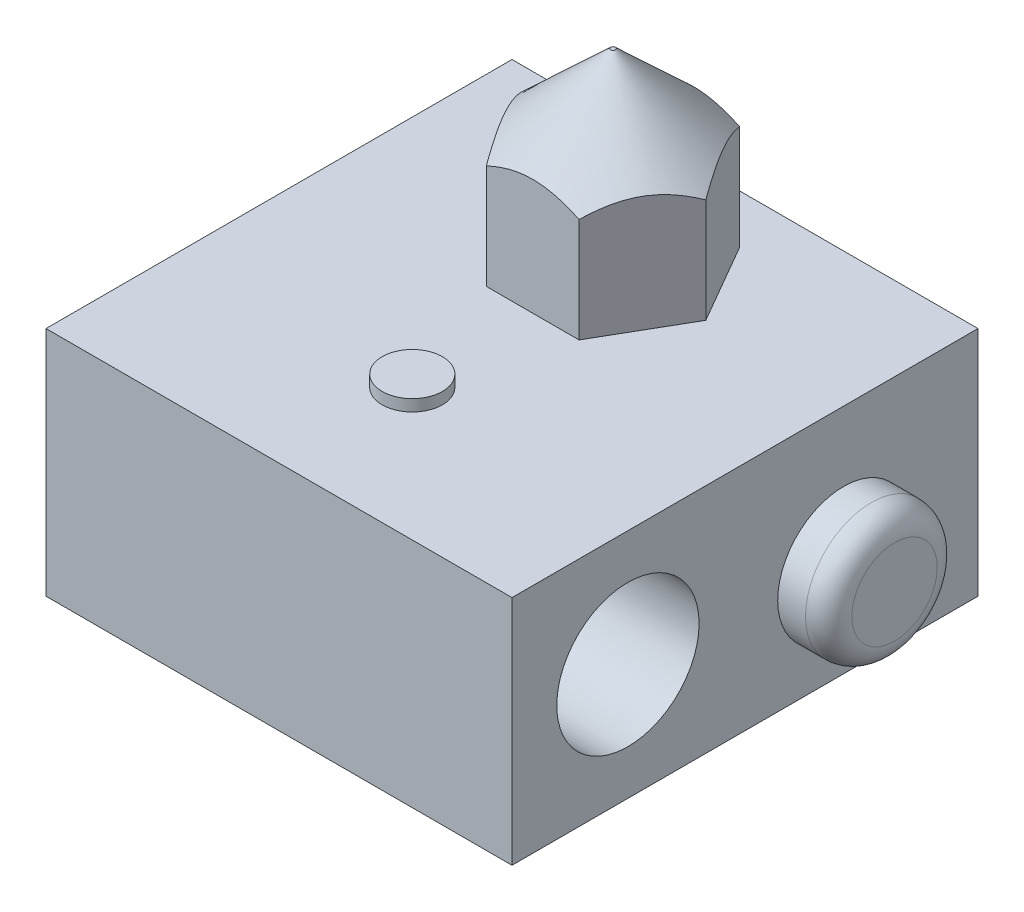
ISO-10303-21;
HEADER;
FILE_DESCRIPTION(('STEP AP214'),'2;1');
FILE_NAME('part.step','',(''),(''),'','','');
FILE_SCHEMA(('AUTOMOTIVE_DESIGN { 1 0 10303 214 1 1 1 1 }'));
ENDSEC;
DATA;
#1=APPLICATION_CONTEXT('core data for automotive mechanical design processes');
#2=APPLICATION_PROTOCOL_DEFINITION('international standard','automotive_design',2000,#1);
#3=PRODUCT_CONTEXT('',#1,'mechanical');
#4=PRODUCT('Part','Part','',(#3));
#5=PRODUCT_RELATED_PRODUCT_CATEGORY('part','',(#4));
#6=PRODUCT_DEFINITION_FORMATION('','',#4);
#7=PRODUCT_DEFINITION_CONTEXT('part definition',#1,'design');
#8=PRODUCT_DEFINITION('design','',#6,#7);
#9=PRODUCT_DEFINITION_SHAPE('','',#8);
#10=(LENGTH_UNIT() NAMED_UNIT(*) SI_UNIT(.MILLI.,.METRE.));
#11=(NAMED_UNIT(*) PLANE_ANGLE_UNIT() SI_UNIT($,.RADIAN.));
#12=(NAMED_UNIT(*) SI_UNIT($,.STERADIAN.) SOLID_ANGLE_UNIT());
#13=UNCERTAINTY_MEASURE_WITH_UNIT(LENGTH_MEASURE(1.E-05),#10,'distance_accuracy_value','');
#14=(GEOMETRIC_REPRESENTATION_CONTEXT(3) GLOBAL_UNCERTAINTY_ASSIGNED_CONTEXT((#13)) GLOBAL_UNIT_ASSIGNED_CONTEXT((#10,
#11,#12)) REPRESENTATION_CONTEXT('',''));
#15=CARTESIAN_POINT('',(0.,0.,0.));
#16=DIRECTION('',(0.,0.,1.));
#17=DIRECTION('',(1.,0.,0.));
#18=AXIS2_PLACEMENT_3D('',#15,#16,#17);
#19=CARTESIAN_POINT('',(0.,10.,0.));
#20=DIRECTION('',(0.,1.,0.));
#21=DIRECTION('',(0.,0.,1.));
#22=AXIS2_PLACEMENT_3D('',#19,#20,#21);
#23=PLANE('',#22);
#24=CARTESIAN_POINT('',(-10.,10.,-5.7));
#25=DIRECTION('',(0.,1.,0.));
#26=DIRECTION('',(0.,0.,1.));
#27=AXIS2_PLACEMENT_3D('',#24,#25,#26);
#28=CIRCLE('',#27,1.3);
#29=CARTESIAN_POINT('',(-10.,10.,-4.4));
#30=VERTEX_POINT('',#29);
#31=EDGE_CURVE('E457',#30,#30,#28,.T.);
#32=ORIENTED_EDGE('',*,*,#31,.F.);
#33=EDGE_LOOP('',(#32));
#34=FACE_BOUND('',#33,.T.);
#35=DIRECTION('',(0.,0.,-1.));
#36=VECTOR('',#35,1.);
#37=CARTESIAN_POINT('',(0.,10.,0.));
#38=LINE('',#37,#36);
#39=CARTESIAN_POINT('',(0.,10.,0.));
#40=VERTEX_POINT('',#39);
#41=CARTESIAN_POINT('',(0.,10.,-20.1));
#42=VERTEX_POINT('',#41);
#43=EDGE_CURVE('E159',#40,#42,#38,.T.);
#44=ORIENTED_EDGE('',*,*,#43,.T.);
#45=DIRECTION('',(-1.,0.,0.));
#46=VECTOR('',#45,1.);
#47=CARTESIAN_POINT('',(0.,10.,-20.1));
#48=LINE('',#47,#46);
#49=CARTESIAN_POINT('',(-20.1,10.,-20.1));
#50=VERTEX_POINT('',#49);
#51=EDGE_CURVE('E163',#42,#50,#48,.T.);
#52=ORIENTED_EDGE('',*,*,#51,.T.);
#53=DIRECTION('',(0.,0.,1.));
#54=VECTOR('',#53,1.);
#55=CARTESIAN_POINT('',(-20.1,10.,0.));
#56=LINE('',#55,#54);
#57=CARTESIAN_POINT('',(-20.1,10.,0.));
#58=VERTEX_POINT('',#57);
#59=EDGE_CURVE('E167',#50,#58,#56,.T.);
#60=ORIENTED_EDGE('',*,*,#59,.T.);
#61=DIRECTION('',(1.,0.,0.));
#62=VECTOR('',#61,1.);
#63=CARTESIAN_POINT('',(0.,10.,0.));
#64=LINE('',#63,#62);
#65=EDGE_CURVE('E170',#58,#40,#64,.T.);
#66=ORIENTED_EDGE('',*,*,#65,.T.);
#67=EDGE_LOOP('',(#44,#52,#60,#66));
#68=FACE_BOUND('',#67,.T.);
#69=DIRECTION('',(-1.,0.,0.));
#70=VECTOR('',#69,1.);
#71=CARTESIAN_POINT('',(-8.17776050806221,10.,-18.));
#72=LINE('',#71,#70);
#73=CARTESIAN_POINT('',(-8.17776050806221,10.,-18.));
#74=VERTEX_POINT('',#73);
#75=CARTESIAN_POINT('',(-12.1787978735463,10.,-18.));
#76=VERTEX_POINT('',#75);
#77=EDGE_CURVE('E268',#74,#76,#72,.T.);
#78=ORIENTED_EDGE('',*,*,#77,.F.);
#79=DIRECTION('',(-0.5,0.,-0.866025403784439));
#80=VECTOR('',#79,1.);
#81=CARTESIAN_POINT('',(-6.17724182532016,10.,-14.535));
#82=LINE('',#81,#80);
#83=CARTESIAN_POINT('',(-6.17724182532016,10.,-14.535));
#84=VERTEX_POINT('',#83);
#85=EDGE_CURVE('E131',#84,#74,#82,.T.);
#86=ORIENTED_EDGE('',*,*,#85,.F.);
#87=DIRECTION('',(0.5,0.,-0.866025403784439));
#88=VECTOR('',#87,1.);
#89=CARTESIAN_POINT('',(-8.17776050806222,10.,-11.07));
#90=LINE('',#89,#88);
#91=CARTESIAN_POINT('',(-8.17776050806222,10.,-11.07));
#92=VERTEX_POINT('',#91);
#93=EDGE_CURVE('E136',#92,#84,#90,.T.);
#94=ORIENTED_EDGE('',*,*,#93,.F.);
#95=DIRECTION('',(1.,0.,0.));
#96=VECTOR('',#95,1.);
#97=CARTESIAN_POINT('',(-12.1787978735463,10.,-11.07));
#98=LINE('',#97,#96);
#99=CARTESIAN_POINT('',(-12.1787978735463,10.,-11.07));
#100=VERTEX_POINT('',#99);
#101=EDGE_CURVE('E144',#100,#92,#98,.T.);
#102=ORIENTED_EDGE('',*,*,#101,.F.);
#103=DIRECTION('',(0.5,0.,0.866025403784439));
#104=VECTOR('',#103,1.);
#105=CARTESIAN_POINT('',(-14.1793165562884,10.,-14.535));
#106=LINE('',#105,#104);
#107=CARTESIAN_POINT('',(-14.1793165562884,10.,-14.535));
#108=VERTEX_POINT('',#107);
#109=EDGE_CURVE('E278',#108,#100,#106,.T.);
#110=ORIENTED_EDGE('',*,*,#109,.F.);
#111=DIRECTION('',(-0.5,0.,0.866025403784438));
#112=VECTOR('',#111,1.);
#113=CARTESIAN_POINT('',(-12.1787978735463,10.,-18.));
#114=LINE('',#113,#112);
#115=EDGE_CURVE('E271',#76,#108,#114,.T.);
#116=ORIENTED_EDGE('',*,*,#115,.F.);
#117=EDGE_LOOP('',(#78,#86,#94,#102,#110,#116));
#118=FACE_BOUND('',#117,.T.);
#119=ADVANCED_FACE('F39',(#34,#68,#118),#23,.T.);
#120=CARTESIAN_POINT('',(0.,10.,0.));
#121=DIRECTION('',(-1.,0.,0.));
#122=DIRECTION('',(0.,0.,1.));
#123=AXIS2_PLACEMENT_3D('',#120,#121,#122);
#124=PLANE('',#123);
#125=CARTESIAN_POINT('',(0.,4.16,-14.3));
#126=DIRECTION('',(-1.,0.,0.));
#127=DIRECTION('',(0.,0.,1.));
#128=AXIS2_PLACEMENT_3D('',#125,#126,#127);
#129=CIRCLE('',#128,2.84);
#130=CARTESIAN_POINT('',(0.,4.16,-11.46));
#131=VERTEX_POINT('',#130);
#132=EDGE_CURVE('E469',#131,#131,#129,.T.);
#133=ORIENTED_EDGE('',*,*,#132,.T.);
#134=EDGE_LOOP('',(#133));
#135=FACE_BOUND('',#134,.T.);
#136=CARTESIAN_POINT('',(0.,5.,-5.));
#137=DIRECTION('',(1.,0.,0.));
#138=DIRECTION('',(0.,0.,-1.));
#139=AXIS2_PLACEMENT_3D('',#136,#137,#138);
#140=CIRCLE('',#139,3.07);
#141=CARTESIAN_POINT('',(0.,5.,-8.07));
#142=VERTEX_POINT('',#141);
#143=EDGE_CURVE('E474',#142,#142,#140,.T.);
#144=ORIENTED_EDGE('',*,*,#143,.F.);
#145=EDGE_LOOP('',(#144));
#146=FACE_BOUND('',#145,.T.);
#147=DIRECTION('',(0.,0.,-1.));
#148=VECTOR('',#147,1.);
#149=CARTESIAN_POINT('',(0.,0.,0.));
#150=LINE('',#149,#148);
#151=CARTESIAN_POINT('',(0.,0.,0.));
#152=VERTEX_POINT('',#151);
#153=CARTESIAN_POINT('',(0.,0.,-20.1));
#154=VERTEX_POINT('',#153);
#155=EDGE_CURVE('E158',#152,#154,#150,.T.);
#156=ORIENTED_EDGE('',*,*,#155,.T.);
#157=DIRECTION('',(0.,-1.,0.));
#158=VECTOR('',#157,1.);
#159=CARTESIAN_POINT('',(0.,10.,-20.1));
#160=LINE('',#159,#158);
#161=EDGE_CURVE('E196',#42,#154,#160,.T.);
#162=ORIENTED_EDGE('',*,*,#161,.F.);
#163=ORIENTED_EDGE('',*,*,#43,.F.);
#164=DIRECTION('',(0.,-1.,0.));
#165=VECTOR('',#164,1.);
#166=CARTESIAN_POINT('',(0.,10.,0.));
#167=LINE('',#166,#165);
#168=EDGE_CURVE('E173',#40,#152,#167,.T.);
#169=ORIENTED_EDGE('',*,*,#168,.T.);
#170=EDGE_LOOP('',(#156,#162,#163,#169));
#171=FACE_BOUND('',#170,.T.);
#172=ADVANCED_FACE('F221',(#135,#146,#171),#124,.F.);
#173=CARTESIAN_POINT('',(0.,10.,-20.1));
#174=DIRECTION('',(0.,0.,1.));
#175=DIRECTION('',(1.,0.,0.));
#176=AXIS2_PLACEMENT_3D('',#173,#174,#175);
#177=PLANE('',#176);
#178=DIRECTION('',(-1.,0.,0.));
#179=VECTOR('',#178,1.);
#180=CARTESIAN_POINT('',(0.,0.,-20.1));
#181=LINE('',#180,#179);
#182=CARTESIAN_POINT('',(-20.1,0.,-20.1));
#183=VERTEX_POINT('',#182);
#184=EDGE_CURVE('E177',#154,#183,#181,.T.);
#185=ORIENTED_EDGE('',*,*,#184,.T.);
#186=DIRECTION('',(0.,-1.,0.));
#187=VECTOR('',#186,1.);
#188=CARTESIAN_POINT('',(-20.1,10.,-20.1));
#189=LINE('',#188,#187);
#190=EDGE_CURVE('E192',#50,#183,#189,.T.);
#191=ORIENTED_EDGE('',*,*,#190,.F.);
#192=ORIENTED_EDGE('',*,*,#51,.F.);
#193=ORIENTED_EDGE('',*,*,#161,.T.);
#194=EDGE_LOOP('',(#185,#191,#192,#193));
#195=FACE_BOUND('',#194,.T.);
#196=ADVANCED_FACE('F227',(#195),#177,.F.);
#197=CARTESIAN_POINT('',(-20.1,10.,0.));
#198=DIRECTION('',(1.,0.,0.));
#199=DIRECTION('',(0.,0.,-1.));
#200=AXIS2_PLACEMENT_3D('',#197,#198,#199);
#201=PLANE('',#200);
#202=CARTESIAN_POINT('',(-20.1,5.,-5.));
#203=DIRECTION('',(1.,0.,0.));
#204=DIRECTION('',(0.,0.,-1.));
#205=AXIS2_PLACEMENT_3D('',#202,#203,#204);
#206=CIRCLE('',#205,3.07);
#207=CARTESIAN_POINT('',(-20.1,5.,-8.07));
#208=VERTEX_POINT('',#207);
#209=EDGE_CURVE('E475',#208,#208,#206,.T.);
#210=ORIENTED_EDGE('',*,*,#209,.T.);
#211=EDGE_LOOP('',(#210));
#212=FACE_BOUND('',#211,.T.);
#213=DIRECTION('',(0.,0.,1.));
#214=VECTOR('',#213,1.);
#215=CARTESIAN_POINT('',(-20.1,0.,0.));
#216=LINE('',#215,#214);
#217=CARTESIAN_POINT('',(-20.1,0.,0.));
#218=VERTEX_POINT('',#217);
#219=EDGE_CURVE('E180',#183,#218,#216,.T.);
#220=ORIENTED_EDGE('',*,*,#219,.T.);
#221=DIRECTION('',(0.,-1.,0.));
#222=VECTOR('',#221,1.);
#223=CARTESIAN_POINT('',(-20.1,10.,0.));
#224=LINE('',#223,#222);
#225=EDGE_CURVE('E188',#58,#218,#224,.T.);
#226=ORIENTED_EDGE('',*,*,#225,.F.);
#227=ORIENTED_EDGE('',*,*,#59,.F.);
#228=ORIENTED_EDGE('',*,*,#190,.T.);
#229=EDGE_LOOP('',(#220,#226,#227,#228));
#230=FACE_BOUND('',#229,.T.);
#231=ADVANCED_FACE('F242',(#212,#230),#201,.F.);
#232=CARTESIAN_POINT('',(0.,10.,0.));
#233=DIRECTION('',(0.,0.,-1.));
#234=DIRECTION('',(-1.,0.,0.));
#235=AXIS2_PLACEMENT_3D('',#232,#233,#234);
#236=PLANE('',#235);
#237=DIRECTION('',(1.,0.,0.));
#238=VECTOR('',#237,1.);
#239=CARTESIAN_POINT('',(0.,0.,0.));
#240=LINE('',#239,#238);
#241=EDGE_CURVE('E164',#218,#152,#240,.T.);
#242=ORIENTED_EDGE('',*,*,#241,.T.);
#243=ORIENTED_EDGE('',*,*,#168,.F.);
#244=ORIENTED_EDGE('',*,*,#65,.F.);
#245=ORIENTED_EDGE('',*,*,#225,.T.);
#246=EDGE_LOOP('',(#242,#243,#244,#245));
#247=FACE_BOUND('',#246,.T.);
#248=ADVANCED_FACE('F238',(#247),#236,.F.);
#249=CARTESIAN_POINT('',(0.,0.,0.));
#250=DIRECTION('',(0.,1.,0.));
#251=DIRECTION('',(0.,0.,1.));
#252=AXIS2_PLACEMENT_3D('',#249,#250,#251);
#253=PLANE('',#252);
#254=CARTESIAN_POINT('',(-10.1782791908043,0.,-14.535));
#255=DIRECTION('',(0.,-1.,0.));
#256=DIRECTION('',(0.,0.,-1.));
#257=AXIS2_PLACEMENT_3D('',#254,#255,#256);
#258=CIRCLE('',#257,2.675);
#259=CARTESIAN_POINT('',(-10.1782791908043,0.,-17.21));
#260=VERTEX_POINT('',#259);
#261=EDGE_CURVE('E456',#260,#260,#258,.T.);
#262=ORIENTED_EDGE('',*,*,#261,.F.);
#263=EDGE_LOOP('',(#262));
#264=FACE_BOUND('',#263,.T.);
#265=ORIENTED_EDGE('',*,*,#155,.F.);
#266=ORIENTED_EDGE('',*,*,#241,.F.);
#267=ORIENTED_EDGE('',*,*,#219,.F.);
#268=ORIENTED_EDGE('',*,*,#184,.F.);
#269=EDGE_LOOP('',(#265,#266,#267,#268));
#270=FACE_BOUND('',#269,.T.);
#271=ADVANCED_FACE('F235',(#264,#270),#253,.F.);
#272=CARTESIAN_POINT('',(-6.17724182532016,18.15,-14.535));
#273=DIRECTION('',(-0.866025403784439,0.,0.5));
#274=DIRECTION('',(0.5,0.,0.866025403784439));
#275=AXIS2_PLACEMENT_3D('',#272,#273,#274);
#276=PLANE('',#275);
#277=DIRECTION('',(0.,-1.,0.));
#278=VECTOR('',#277,1.);
#279=CARTESIAN_POINT('',(-8.17776050806221,18.15,-18.));
#280=LINE('',#279,#278);
#281=CARTESIAN_POINT('',(-8.17776050806221,14.5,-18.));
#282=VERTEX_POINT('',#281);
#283=EDGE_CURVE('E129',#282,#74,#280,.T.);
#284=ORIENTED_EDGE('',*,*,#283,.F.);
#285=CARTESIAN_POINT('',(-8.17787597811605,14.4998919559333,-18.0002));
#286=CARTESIAN_POINT('',(-8.10496643233774,14.5680581905201,-17.8739169623552));
#287=CARTESIAN_POINT('',(-8.03088205093946,14.631847473232,-17.7455990497261));
#288=CARTESIAN_POINT('',(-7.8799847268207,14.7475698967508,-17.4842372176262));
#289=CARTESIAN_POINT('',(-7.80315894483399,14.7994354177771,-17.351171059894));
#290=CARTESIAN_POINT('',(-7.64859243023081,14.8865960133476,-17.0834540034525));
#291=CARTESIAN_POINT('',(-7.57089214640926,14.9221688865829,-16.948873164111));
#292=CARTESIAN_POINT('',(-7.41406683961953,14.9746279401331,-16.6772437648386));
#293=CARTESIAN_POINT('',(-7.33494562051771,14.9915581130619,-16.5402017933975));
#294=CARTESIAN_POINT('',(-7.18636819507381,15.0040893238164,-16.2828581436708));
#295=CARTESIAN_POINT('',(-7.11696263852111,15.002129289844,-16.162644193394));
#296=CARTESIAN_POINT('',(-6.97865168973416,14.9828131826316,-15.9230826028519));
#297=CARTESIAN_POINT('',(-6.90974667970046,14.9654463827039,-15.8037356245775));
#298=CARTESIAN_POINT('',(-6.77315384892855,14.9167875549176,-15.5671499017309));
#299=CARTESIAN_POINT('',(-6.70546701988292,14.8854846721375,-15.4499128748206));
#300=CARTESIAN_POINT('',(-6.57176241443205,14.8111774445511,-15.2183297049738));
#301=CARTESIAN_POINT('',(-6.50574429716871,14.7681755109005,-15.1039829716537));
#302=CARTESIAN_POINT('',(-6.39579541981121,14.687648702307,-14.9135459298353));
#303=CARTESIAN_POINT('',(-6.3514003497324,14.6526014993247,-14.8366514128532));
#304=CARTESIAN_POINT('',(-6.26358861588134,14.57884745446,-14.6845570283225));
#305=CARTESIAN_POINT('',(-6.22016868514778,14.540156217657,-14.6093515022308));
#306=CARTESIAN_POINT('',(-6.17712635526633,14.4998919559333,-14.5348));
#307=B_SPLINE_CURVE_WITH_KNOTS('',3,(#285,#286,#287,#288,#289,#290,#291,#292,#293,#294,#295,
#296,#297,#298,#299,#300,#301,#302,#303,#304,#305,#306),.UNSPECIFIED.,.F.,.F.,(4,2,2,2,2,2,2,2,
2,2,4),(0.,0.483241120159835,0.969158586776282,1.44645055165871,1.92261378412961,
2.33821493595867,2.75410567000706,3.17032091282932,3.58645043924788,3.87273714789289,
4.15784925299525),.UNSPECIFIED.);
#308=CARTESIAN_POINT('',(-6.17724182532016,14.5,-14.535));
#309=VERTEX_POINT('',#308);
#310=EDGE_CURVE('E118',#282,#309,#307,.T.);
#311=ORIENTED_EDGE('',*,*,#310,.T.);
#312=DIRECTION('',(0.,-1.,0.));
#313=VECTOR('',#312,1.);
#314=CARTESIAN_POINT('',(-6.17724182532016,18.15,-14.535));
#315=LINE('',#314,#313);
#316=EDGE_CURVE('E128',#309,#84,#315,.T.);
#317=ORIENTED_EDGE('',*,*,#316,.T.);
#318=ORIENTED_EDGE('',*,*,#85,.T.);
#319=EDGE_LOOP('',(#284,#311,#317,#318));
#320=FACE_BOUND('',#319,.T.);
#321=ADVANCED_FACE('F126',(#320),#276,.F.);
#322=CARTESIAN_POINT('',(-8.17776050806221,18.15,-18.));
#323=DIRECTION('',(0.,0.,1.));
#324=DIRECTION('',(1.,0.,0.));
#325=AXIS2_PLACEMENT_3D('',#322,#323,#324);
#326=PLANE('',#325);
#327=DIRECTION('',(0.,-1.,0.));
#328=VECTOR('',#327,1.);
#329=CARTESIAN_POINT('',(-12.1787978735463,18.15,-18.));
#330=LINE('',#329,#328);
#331=CARTESIAN_POINT('',(-12.1787978735463,14.5,-18.));
#332=VERTEX_POINT('',#331);
#333=EDGE_CURVE('E153',#332,#76,#330,.T.);
#334=ORIENTED_EDGE('',*,*,#333,.F.);
#335=CARTESIAN_POINT('',(-19.0147006174352,9.36285671163671,-18.));
#336=CARTESIAN_POINT('',(-18.8758133775291,9.48383531474893,-18.));
#337=CARTESIAN_POINT('',(-18.7367404273081,9.60460059468767,-18.));
#338=CARTESIAN_POINT('',(-18.45816397849,9.84563548071962,-18.));
#339=CARTESIAN_POINT('',(-18.3186604768172,9.9659050832574,-18.));
#340=CARTESIAN_POINT('',(-17.8992454023463,10.3260128051485,-18.));
#341=CARTESIAN_POINT('',(-17.6186010882329,10.5649998675573,-18.));
#342=CARTESIAN_POINT('',(-17.0476452031293,11.0458456302739,-18.));
#343=CARTESIAN_POINT('',(-16.7572676651225,11.2876261081019,-18.));
#344=CARTESIAN_POINT('',(-16.1728970014436,11.766494109917,-18.));
#345=CARTESIAN_POINT('',(-15.8789058243607,12.0035839974825,-18.));
#346=CARTESIAN_POINT('',(-15.4338986169012,12.3540732958855,-18.));
#347=CARTESIAN_POINT('',(-15.2849037036489,12.4700372910427,-18.));
#348=CARTESIAN_POINT('',(-14.9852696503361,12.699818265257,-18.));
#349=CARTESIAN_POINT('',(-14.834630553004,12.8136352998998,-18.));
#350=CARTESIAN_POINT('',(-14.531077959979,13.0387593329264,-18.));
#351=CARTESIAN_POINT('',(-14.3781609749968,13.1500616393109,-18.));
#352=CARTESIAN_POINT('',(-14.0698428969585,13.3691656363101,-18.));
#353=CARTESIAN_POINT('',(-13.9144419509355,13.4769675329878,-18.));
#354=CARTESIAN_POINT('',(-13.6020787821066,13.6869531356201,-18.));
#355=CARTESIAN_POINT('',(-13.4451467443273,13.7891815159524,-18.));
#356=CARTESIAN_POINT('',(-13.127451986753,13.9876652341221,-18.));
#357=CARTESIAN_POINT('',(-12.9666881163968,14.0839187458396,-18.));
#358=CARTESIAN_POINT('',(-12.6409745794327,14.2679634766559,-18.));
#359=CARTESIAN_POINT('',(-12.4760387357564,14.3557789383225,-18.));
#360=CARTESIAN_POINT('',(-12.1406726647224,14.520103986693,-18.));
#361=CARTESIAN_POINT('',(-11.9702471144701,14.5966229028573,-18.));
#362=CARTESIAN_POINT('',(-11.6850195932294,14.709551783688,-18.));
#363=CARTESIAN_POINT('',(-11.5720374067441,14.7505378589375,-18.));
#364=CARTESIAN_POINT('',(-11.3434647431741,14.8246187512217,-18.));
#365=CARTESIAN_POINT('',(-11.2278739974118,14.8577127512867,-18.));
#366=CARTESIAN_POINT('',(-10.9950711988485,14.9143343667784,-18.));
#367=CARTESIAN_POINT('',(-10.8778729919812,14.9379180574556,-18.));
#368=CARTESIAN_POINT('',(-10.6418398539737,14.9744691769164,-18.));
#369=CARTESIAN_POINT('',(-10.5230054451897,14.9874399174736,-18.));
#370=CARTESIAN_POINT('',(-10.2835219440167,15.0019914014286,-18.));
#371=CARTESIAN_POINT('',(-10.1628662341173,15.0034656610684,-18.));
#372=CARTESIAN_POINT('',(-9.92199330892492,14.9946380401109,-18.));
#373=CARTESIAN_POINT('',(-9.80177610627438,14.9843358226397,-18.));
#374=CARTESIAN_POINT('',(-9.56224698832582,14.9525839466569,-18.));
#375=CARTESIAN_POINT('',(-9.44294241927608,14.9310797862718,-18.));
#376=CARTESIAN_POINT('',(-9.2065759930759,14.8781874113085,-18.));
#377=CARTESIAN_POINT('',(-9.08951448631399,14.8467976656436,-18.));
#378=CARTESIAN_POINT('',(-8.74809350716715,14.7419200376983,-18.));
#379=CARTESIAN_POINT('',(-8.52730892733131,14.6567468497045,-18.));
#380=CARTESIAN_POINT('',(-8.20342693096893,14.5130093637491,-18.));
#381=CARTESIAN_POINT('',(-8.09657424868274,14.4623726214482,-18.));
#382=CARTESIAN_POINT('',(-7.88504621948667,14.3567200017091,-18.));
#383=CARTESIAN_POINT('',(-7.78037064069987,14.3017045936735,-18.));
#384=CARTESIAN_POINT('',(-7.5717186086707,14.1874297277328,-18.));
#385=CARTESIAN_POINT('',(-7.46776627391139,14.1281266726738,-18.));
#386=CARTESIAN_POINT('',(-7.26161606646823,14.0065374423959,-18.));
#387=CARTESIAN_POINT('',(-7.15941832526858,13.9442510449279,-18.));
#388=CARTESIAN_POINT('',(-6.85531232569592,13.7538597331894,-18.));
#389=CARTESIAN_POINT('',(-6.65568907137518,13.6221092223889,-18.));
#390=CARTESIAN_POINT('',(-6.22534261625957,13.3274697393368,-18.));
#391=CARTESIAN_POINT('',(-5.99553241653929,13.1632618826498,-18.));
#392=CARTESIAN_POINT('',(-5.54055017578016,12.8285058919325,-18.));
#393=CARTESIAN_POINT('',(-5.31537889933428,12.6579567255089,-18.));
#394=CARTESIAN_POINT('',(-4.86828775836992,12.3122313212827,-18.));
#395=CARTESIAN_POINT('',(-4.64637120946111,12.1370508141565,-18.));
#396=CARTESIAN_POINT('',(-4.20515515373602,11.7834213555717,-18.));
#397=CARTESIAN_POINT('',(-3.98585571969953,11.604972313566,-18.));
#398=CARTESIAN_POINT('',(-3.5624865465556,11.2564908445819,-18.));
#399=CARTESIAN_POINT('',(-3.35829807952971,11.0866023547107,-18.));
#400=CARTESIAN_POINT('',(-2.95134030390075,10.7451266564853,-18.));
#401=CARTESIAN_POINT('',(-2.74857102744141,10.5735394098666,-18.));
#402=CARTESIAN_POINT('',(-2.34460671374112,10.2293826863745,-18.));
#403=CARTESIAN_POINT('',(-2.14340925814877,10.0568160446385,-18.));
#404=CARTESIAN_POINT('',(-1.74196914989016,9.71059405451314,-18.));
#405=CARTESIAN_POINT('',(-1.54172645339962,9.53693875695783,-18.));
#406=CARTESIAN_POINT('',(-1.34185776417337,9.36285671163671,-18.));
#407=B_SPLINE_CURVE_WITH_KNOTS('',3,(#335,#336,#337,#338,#339,#340,#341,#342,#343,#344,#345,
#346,#347,#348,#349,#350,#351,#352,#353,#354,#355,#356,#357,#358,#359,#360,#361,#362,#363,#364,
#365,#366,#367,#368,#369,#370,#371,#372,#373,#374,#375,#376,#377,#378,#379,#380,#381,#382,#383,
#384,#385,#386,#387,#388,#389,#390,#391,#392,#393,#394,#395,#396,#397,#398,#399,#400,#401,#402,
#403,#404,#405,#406),.UNSPECIFIED.,.F.,.F.,(4,2,2,2,2,2,2,2,2,2,2,2,2,2,2,2,2,2,2,2,2,2,2,2,2,2,
2,2,2,2,2,2,2,2,2,4),(0.,0.552565633241739,1.1051352230673,2.21095859860381,3.34450616794044,
4.47746719654478,5.04386597618599,5.61025007135914,6.17761576498881,6.74494799800572,
7.30672532600763,7.86867351505128,8.42895566610949,8.98877247773612,9.34910108955568,
9.7094669855944,10.067675860957,10.4257729144773,10.7871828730284,11.1486031702067,
11.5117985745181,11.8750502584882,12.5829485738153,12.9376397845179,13.2922930226173,
13.6512740372505,14.0102818364914,14.7276026267629,15.5747973988184,16.4221307071156,
17.2702744038191,18.1184416319854,18.9152964030544,19.712169164335,20.5073611275623,
21.302516232465),.UNSPECIFIED.);
#408=EDGE_CURVE('E132',#332,#282,#407,.T.);
#409=ORIENTED_EDGE('',*,*,#408,.T.);
#410=ORIENTED_EDGE('',*,*,#283,.T.);
#411=ORIENTED_EDGE('',*,*,#77,.T.);
#412=EDGE_LOOP('',(#334,#409,#410,#411));
#413=FACE_BOUND('',#412,.T.);
#414=ADVANCED_FACE('F298',(#413),#326,.F.);
#415=CARTESIAN_POINT('',(-12.1787978735463,18.15,-18.));
#416=DIRECTION('',(0.866025403784438,0.,0.5));
#417=DIRECTION('',(0.5,0.,-0.866025403784438));
#418=AXIS2_PLACEMENT_3D('',#415,#416,#417);
#419=PLANE('',#418);
#420=DIRECTION('',(0.,-1.,0.));
#421=VECTOR('',#420,1.);
#422=CARTESIAN_POINT('',(-14.1793165562884,18.15,-14.535));
#423=LINE('',#422,#421);
#424=CARTESIAN_POINT('',(-14.1793165562884,14.5,-14.535));
#425=VERTEX_POINT('',#424);
#426=EDGE_CURVE('E150',#425,#108,#423,.T.);
#427=ORIENTED_EDGE('',*,*,#426,.F.);
#428=CARTESIAN_POINT('',(-14.1794320263422,14.4998919559333,-14.5348));
#429=CARTESIAN_POINT('',(-14.1065224805639,14.5680581905201,-14.6610830376448));
#430=CARTESIAN_POINT('',(-14.0324380991656,14.631847473232,-14.7894009502739));
#431=CARTESIAN_POINT('',(-13.8815407750469,14.7475698967508,-15.0507627823738));
#432=CARTESIAN_POINT('',(-13.8047149930601,14.7994354177771,-15.183828940106));
#433=CARTESIAN_POINT('',(-13.650148478457,14.8865960133476,-15.4515459965475));
#434=CARTESIAN_POINT('',(-13.5724481946354,14.9221688865829,-15.586126835889));
#435=CARTESIAN_POINT('',(-13.4156228878457,14.9746279401331,-15.8577562351614));
#436=CARTESIAN_POINT('',(-13.3365016687439,14.9915581130619,-15.9947982066025));
#437=CARTESIAN_POINT('',(-13.1879242433,15.0040893238164,-16.2521418563292));
#438=CARTESIAN_POINT('',(-13.1185186867473,15.002129289844,-16.372355806606));
#439=CARTESIAN_POINT('',(-12.9802077379603,14.9828131826316,-16.6119173971481));
#440=CARTESIAN_POINT('',(-12.9113027279266,14.9654463827039,-16.7312643754225));
#441=CARTESIAN_POINT('',(-12.7747098971547,14.9167875549176,-16.9678500982691));
#442=CARTESIAN_POINT('',(-12.7070230681091,14.8854846721375,-17.0850871251794));
#443=CARTESIAN_POINT('',(-12.5733184626582,14.8111774445511,-17.3166702950262));
#444=CARTESIAN_POINT('',(-12.5073003453949,14.7681755109005,-17.4310170283463));
#445=CARTESIAN_POINT('',(-12.3973514680374,14.687648702307,-17.6214540701647));
#446=CARTESIAN_POINT('',(-12.3529563979586,14.6526014993247,-17.6983485871468));
#447=CARTESIAN_POINT('',(-12.2651446641075,14.57884745446,-17.8504429716775));
#448=CARTESIAN_POINT('',(-12.2217247333739,14.540156217657,-17.9256484977692));
#449=CARTESIAN_POINT('',(-12.1786824034925,14.4998919559333,-18.0002));
#450=B_SPLINE_CURVE_WITH_KNOTS('',3,(#428,#429,#430,#431,#432,#433,#434,#435,#436,#437,#438,
#439,#440,#441,#442,#443,#444,#445,#446,#447,#448,#449),.UNSPECIFIED.,.F.,.F.,(4,2,2,2,2,2,2,2,
2,2,4),(0.,0.483241120159832,0.96915858677628,1.44645055165871,1.92261378412961,
2.33821493595867,2.75410567000706,3.17032091282932,3.58645043924788,3.87273714789289,
4.15784925299525),.UNSPECIFIED.);
#451=EDGE_CURVE('E297',#425,#332,#450,.T.);
#452=ORIENTED_EDGE('',*,*,#451,.T.);
#453=ORIENTED_EDGE('',*,*,#333,.T.);
#454=ORIENTED_EDGE('',*,*,#115,.T.);
#455=EDGE_LOOP('',(#427,#452,#453,#454));
#456=FACE_BOUND('',#455,.T.);
#457=ADVANCED_FACE('F296',(#456),#419,.F.);
#458=CARTESIAN_POINT('',(-14.1793165562884,18.15,-14.535));
#459=DIRECTION('',(0.866025403784439,0.,-0.5));
#460=DIRECTION('',(-0.5,0.,-0.866025403784439));
#461=AXIS2_PLACEMENT_3D('',#458,#459,#460);
#462=PLANE('',#461);
#463=DIRECTION('',(0.,-1.,0.));
#464=VECTOR('',#463,1.);
#465=CARTESIAN_POINT('',(-12.1787978735463,18.15,-11.07));
#466=LINE('',#465,#464);
#467=CARTESIAN_POINT('',(-12.1787978735463,14.5,-11.07));
#468=VERTEX_POINT('',#467);
#469=EDGE_CURVE('E142',#468,#100,#466,.T.);
#470=ORIENTED_EDGE('',*,*,#469,.F.);
#471=CARTESIAN_POINT('',(-12.1786824034925,14.4998919559333,-11.0698));
#472=CARTESIAN_POINT('',(-12.2515919492708,14.5680581905201,-11.1960830376448));
#473=CARTESIAN_POINT('',(-12.3256763306691,14.631847473232,-11.3244009502739));
#474=CARTESIAN_POINT('',(-12.4765736547878,14.7475698967508,-11.5857627823738));
#475=CARTESIAN_POINT('',(-12.5533994367745,14.7994354177771,-11.718828940106));
#476=CARTESIAN_POINT('',(-12.7079659513777,14.8865960133476,-11.9865459965475));
#477=CARTESIAN_POINT('',(-12.7856662351993,14.9221688865829,-12.121126835889));
#478=CARTESIAN_POINT('',(-12.942491541989,14.9746279401331,-12.3927562351614));
#479=CARTESIAN_POINT('',(-13.0216127610908,14.9915581130619,-12.5297982066025));
#480=CARTESIAN_POINT('',(-13.1701901865347,15.0040893238164,-12.7871418563292));
#481=CARTESIAN_POINT('',(-13.2395957430874,15.002129289844,-12.907355806606));
#482=CARTESIAN_POINT('',(-13.3779066918744,14.9828131826316,-13.1469173971481));
#483=CARTESIAN_POINT('',(-13.4468117019081,14.9654463827039,-13.2662643754225));
#484=CARTESIAN_POINT('',(-13.58340453268,14.9167875549176,-13.5028500982691));
#485=CARTESIAN_POINT('',(-13.6510913617256,14.8854846721375,-13.6200871251794));
#486=CARTESIAN_POINT('',(-13.7847959671765,14.8111774445511,-13.8516702950262));
#487=CARTESIAN_POINT('',(-13.8508140844398,14.7681755109005,-13.9660170283463));
#488=CARTESIAN_POINT('',(-13.9607629617973,14.687648702307,-14.1564540701647));
#489=CARTESIAN_POINT('',(-14.0051580318761,14.6526014993247,-14.2333485871468));
#490=CARTESIAN_POINT('',(-14.0929697657272,14.57884745446,-14.3854429716775));
#491=CARTESIAN_POINT('',(-14.1363896964608,14.540156217657,-14.4606484977692));
#492=CARTESIAN_POINT('',(-14.1794320263422,14.4998919559333,-14.5352));
#493=B_SPLINE_CURVE_WITH_KNOTS('',3,(#471,#472,#473,#474,#475,#476,#477,#478,#479,#480,#481,
#482,#483,#484,#485,#486,#487,#488,#489,#490,#491,#492),.UNSPECIFIED.,.F.,.F.,(4,2,2,2,2,2,2,2,
2,2,4),(0.,0.483241120159834,0.969158586776284,1.44645055165871,1.92261378412962,
2.33821493595868,2.75410567000706,3.17032091282932,3.58645043924788,3.8727371478929,
4.15784925299526),.UNSPECIFIED.);
#494=EDGE_CURVE('E293',#468,#425,#493,.T.);
#495=ORIENTED_EDGE('',*,*,#494,.T.);
#496=ORIENTED_EDGE('',*,*,#426,.T.);
#497=ORIENTED_EDGE('',*,*,#109,.T.);
#498=EDGE_LOOP('',(#470,#495,#496,#497));
#499=FACE_BOUND('',#498,.T.);
#500=ADVANCED_FACE('F290',(#499),#462,.F.);
#501=CARTESIAN_POINT('',(-12.1787978735463,18.15,-11.07));
#502=DIRECTION('',(0.,0.,-1.));
#503=DIRECTION('',(-1.,0.,0.));
#504=AXIS2_PLACEMENT_3D('',#501,#502,#503);
#505=PLANE('',#504);
#506=DIRECTION('',(0.,-1.,0.));
#507=VECTOR('',#506,1.);
#508=CARTESIAN_POINT('',(-8.17776050806222,18.15,-11.07));
#509=LINE('',#508,#507);
#510=CARTESIAN_POINT('',(-8.17776050806222,14.5,-11.07));
#511=VERTEX_POINT('',#510);
#512=EDGE_CURVE('E62',#511,#92,#509,.T.);
#513=ORIENTED_EDGE('',*,*,#512,.F.);
#514=CARTESIAN_POINT('',(-1.34185776417338,9.36285671163672,-11.07));
#515=CARTESIAN_POINT('',(-1.48074500407941,9.48383531474893,-11.07));
#516=CARTESIAN_POINT('',(-1.61981795430042,9.60460059468768,-11.07));
#517=CARTESIAN_POINT('',(-1.89839440311849,9.84563548071963,-11.07));
#518=CARTESIAN_POINT('',(-2.03789790479131,9.96590508325741,-11.07));
#519=CARTESIAN_POINT('',(-2.45731297926223,10.3260128051485,-11.07));
#520=CARTESIAN_POINT('',(-2.73795729337567,10.5649998675573,-11.07));
#521=CARTESIAN_POINT('',(-3.30891317847928,11.0458456302739,-11.07));
#522=CARTESIAN_POINT('',(-3.59929071648602,11.2876261081019,-11.07));
#523=CARTESIAN_POINT('',(-4.18366138016491,11.766494109917,-11.07));
#524=CARTESIAN_POINT('',(-4.47765255724781,12.0035839974825,-11.07));
#525=CARTESIAN_POINT('',(-4.9226597647073,12.3540732958855,-11.07));
#526=CARTESIAN_POINT('',(-5.0716546779596,12.4700372910427,-11.07));
#527=CARTESIAN_POINT('',(-5.37128873127241,12.699818265257,-11.07));
#528=CARTESIAN_POINT('',(-5.52192782860451,12.8136352998998,-11.07));
#529=CARTESIAN_POINT('',(-5.82548042162957,13.0387593329264,-11.07));
#530=CARTESIAN_POINT('',(-5.97839740661174,13.1500616393109,-11.07));
#531=CARTESIAN_POINT('',(-6.28671548465002,13.3691656363101,-11.07));
#532=CARTESIAN_POINT('',(-6.44211643067302,13.4769675329878,-11.07));
#533=CARTESIAN_POINT('',(-6.75447959950195,13.6869531356201,-11.07));
#534=CARTESIAN_POINT('',(-6.91141163728122,13.7891815159524,-11.07));
#535=CARTESIAN_POINT('',(-7.22910639485556,13.9876652341221,-11.07));
#536=CARTESIAN_POINT('',(-7.38987026521172,14.0839187458396,-11.07));
#537=CARTESIAN_POINT('',(-7.71558380217582,14.2679634766559,-11.07));
#538=CARTESIAN_POINT('',(-7.88051964585215,14.3557789383225,-11.07));
#539=CARTESIAN_POINT('',(-8.21588571688613,14.520103986693,-11.07));
#540=CARTESIAN_POINT('',(-8.38631126713842,14.5966229028573,-11.07));
#541=CARTESIAN_POINT('',(-8.67153878837915,14.709551783688,-11.07));
#542=CARTESIAN_POINT('',(-8.78452097486442,14.7505378589375,-11.07));
#543=CARTESIAN_POINT('',(-9.01309363843447,14.8246187512217,-11.07));
#544=CARTESIAN_POINT('',(-9.12868438419678,14.8577127512867,-11.07));
#545=CARTESIAN_POINT('',(-9.36148718276005,14.9143343667784,-11.07));
#546=CARTESIAN_POINT('',(-9.47868538962737,14.9379180574556,-11.07));
#547=CARTESIAN_POINT('',(-9.71471852763483,14.9744691769164,-11.07));
#548=CARTESIAN_POINT('',(-9.83355293641883,14.9874399174736,-11.07));
#549=CARTESIAN_POINT('',(-10.0730364375918,15.0019914014286,-11.07));
#550=CARTESIAN_POINT('',(-10.1936921474912,15.0034656610684,-11.07));
#551=CARTESIAN_POINT('',(-10.4345650726836,14.9946380401109,-11.07));
#552=CARTESIAN_POINT('',(-10.5547822753342,14.9843358226397,-11.07));
#553=CARTESIAN_POINT('',(-10.7943113932827,14.9525839466569,-11.07));
#554=CARTESIAN_POINT('',(-10.9136159623325,14.9310797862718,-11.07));
#555=CARTESIAN_POINT('',(-11.1499823885326,14.8781874113085,-11.07));
#556=CARTESIAN_POINT('',(-11.2670438952945,14.8467976656436,-11.07));
#557=CARTESIAN_POINT('',(-11.6084648744414,14.7419200376983,-11.07));
#558=CARTESIAN_POINT('',(-11.8292494542772,14.6567468497045,-11.07));
#559=CARTESIAN_POINT('',(-12.1531314506396,14.5130093637491,-11.07));
#560=CARTESIAN_POINT('',(-12.2599841329258,14.4623726214482,-11.07));
#561=CARTESIAN_POINT('',(-12.4715121621219,14.356720001709,-11.07));
#562=CARTESIAN_POINT('',(-12.5761877409087,14.3017045936735,-11.07));
#563=CARTESIAN_POINT('',(-12.7848397729378,14.1874297277328,-11.07));
#564=CARTESIAN_POINT('',(-12.8887921076972,14.1281266726738,-11.07));
#565=CARTESIAN_POINT('',(-13.0949423151403,14.0065374423959,-11.07));
#566=CARTESIAN_POINT('',(-13.19714005634,13.9442510449279,-11.07));
#567=CARTESIAN_POINT('',(-13.5012460559126,13.7538597331894,-11.07));
#568=CARTESIAN_POINT('',(-13.7008693102334,13.6221092223889,-11.07));
#569=CARTESIAN_POINT('',(-14.131215765349,13.3274697393368,-11.07));
#570=CARTESIAN_POINT('',(-14.3610259650693,13.1632618826498,-11.07));
#571=CARTESIAN_POINT('',(-14.8160082058284,12.8285058919325,-11.07));
#572=CARTESIAN_POINT('',(-15.0411794822743,12.6579567255089,-11.07));
#573=CARTESIAN_POINT('',(-15.4882706232386,12.3122313212827,-11.07));
#574=CARTESIAN_POINT('',(-15.7101871721474,12.1370508141565,-11.07));
#575=CARTESIAN_POINT('',(-16.1514032278725,11.7834213555717,-11.07));
#576=CARTESIAN_POINT('',(-16.370702661909,11.604972313566,-11.07));
#577=CARTESIAN_POINT('',(-16.7940718350529,11.2564908445819,-11.07));
#578=CARTESIAN_POINT('',(-16.9982603020788,11.0866023547107,-11.07));
#579=CARTESIAN_POINT('',(-17.4052180777078,10.7451266564853,-11.07));
#580=CARTESIAN_POINT('',(-17.6079873541671,10.5735394098666,-11.07));
#581=CARTESIAN_POINT('',(-18.0119516678674,10.2293826863745,-11.07));
#582=CARTESIAN_POINT('',(-18.2131491234598,10.0568160446385,-11.07));
#583=CARTESIAN_POINT('',(-18.6145892317184,9.71059405451314,-11.07));
#584=CARTESIAN_POINT('',(-18.8148319282089,9.53693875695783,-11.07));
#585=CARTESIAN_POINT('',(-19.0147006174352,9.36285671163671,-11.07));
#586=B_SPLINE_CURVE_WITH_KNOTS('',3,(#514,#515,#516,#517,#518,#519,#520,#521,#522,#523,#524,
#525,#526,#527,#528,#529,#530,#531,#532,#533,#534,#535,#536,#537,#538,#539,#540,#541,#542,#543,
#544,#545,#546,#547,#548,#549,#550,#551,#552,#553,#554,#555,#556,#557,#558,#559,#560,#561,#562,
#563,#564,#565,#566,#567,#568,#569,#570,#571,#572,#573,#574,#575,#576,#577,#578,#579,#580,#581,
#582,#583,#584,#585),.UNSPECIFIED.,.F.,.F.,(4,2,2,2,2,2,2,2,2,2,2,2,2,2,2,2,2,2,2,2,2,2,2,2,2,2,
2,2,2,2,2,2,2,2,2,4),(0.,0.552565633241739,1.1051352230673,2.2109585986038,3.34450616794044,
4.47746719654477,5.04386597618599,5.61025007135913,6.1776157649888,6.74494799800571,
7.30672532600762,7.86867351505127,8.42895566610948,8.98877247773611,9.34910108955567,
9.70946698559439,10.067675860957,10.4257729144773,10.7871828730284,11.1486031702067,
11.5117985745181,11.8750502584882,12.5829485738153,12.9376397845179,13.2922930226173,
13.6512740372505,14.0102818364914,14.7276026267629,15.5747973988184,16.4221307071156,
17.2702744038191,18.1184416319854,18.9152964030544,19.712169164335,20.5073611275622,
21.302516232465),.UNSPECIFIED.);
#587=EDGE_CURVE('E55',#511,#468,#586,.T.);
#588=ORIENTED_EDGE('',*,*,#587,.T.);
#589=ORIENTED_EDGE('',*,*,#469,.T.);
#590=ORIENTED_EDGE('',*,*,#101,.T.);
#591=EDGE_LOOP('',(#513,#588,#589,#590));
#592=FACE_BOUND('',#591,.T.);
#593=ADVANCED_FACE('F287',(#592),#505,.F.);
#594=CARTESIAN_POINT('',(-8.17776050806222,18.15,-11.07));
#595=DIRECTION('',(-0.866025403784439,0.,-0.5));
#596=DIRECTION('',(-0.5,0.,0.866025403784439));
#597=AXIS2_PLACEMENT_3D('',#594,#595,#596);
#598=PLANE('',#597);
#599=ORIENTED_EDGE('',*,*,#316,.F.);
#600=CARTESIAN_POINT('',(-6.17712635526633,14.4998919559333,-14.5352));
#601=CARTESIAN_POINT('',(-6.25003590104463,14.5680581905201,-14.4089169623552));
#602=CARTESIAN_POINT('',(-6.32412028244291,14.631847473232,-14.2805990497261));
#603=CARTESIAN_POINT('',(-6.47501760656167,14.7475698967508,-14.0192372176262));
#604=CARTESIAN_POINT('',(-6.55184338854838,14.7994354177771,-13.886171059894));
#605=CARTESIAN_POINT('',(-6.70640990315156,14.8865960133476,-13.6184540034525));
#606=CARTESIAN_POINT('',(-6.78411018697311,14.9221688865829,-13.483873164111));
#607=CARTESIAN_POINT('',(-6.94093549376285,14.9746279401331,-13.2122437648386));
#608=CARTESIAN_POINT('',(-7.02005671286467,14.991558113062,-13.0752017933975));
#609=CARTESIAN_POINT('',(-7.16863413830857,15.0040893238164,-12.8178581436709));
#610=CARTESIAN_POINT('',(-7.23803969486127,15.002129289844,-12.697644193394));
#611=CARTESIAN_POINT('',(-7.37635064364822,14.9828131826316,-12.4580826028519));
#612=CARTESIAN_POINT('',(-7.44525565368192,14.9654463827039,-12.3387356245775));
#613=CARTESIAN_POINT('',(-7.58184848445383,14.9167875549176,-12.1021499017309));
#614=CARTESIAN_POINT('',(-7.64953531349946,14.8854846721375,-11.9849128748207));
#615=CARTESIAN_POINT('',(-7.78323991895033,14.8111774445511,-11.7533297049738));
#616=CARTESIAN_POINT('',(-7.84925803621366,14.7681755109005,-11.6389829716537));
#617=CARTESIAN_POINT('',(-7.95920691357117,14.687648702307,-11.4485459298353));
#618=CARTESIAN_POINT('',(-8.00360198364998,14.6526014993247,-11.3716514128532));
#619=CARTESIAN_POINT('',(-8.09141371750104,14.57884745446,-11.2195570283225));
#620=CARTESIAN_POINT('',(-8.1348336482346,14.540156217657,-11.1443515022308));
#621=CARTESIAN_POINT('',(-8.17787597811606,14.4998919559333,-11.0698));
#622=B_SPLINE_CURVE_WITH_KNOTS('',3,(#600,#601,#602,#603,#604,#605,#606,#607,#608,#609,#610,
#611,#612,#613,#614,#615,#616,#617,#618,#619,#620,#621),.UNSPECIFIED.,.F.,.F.,(4,2,2,2,2,2,2,2,
2,2,4),(0.,0.48324112015983,0.969158586776278,1.4464505516587,1.92261378412961,2.33821493595867,
2.75410567000705,3.17032091282932,3.58645043924787,3.87273714789289,4.15784925299526),.UNSPECIFIED.);
#623=EDGE_CURVE('E115',#309,#511,#622,.T.);
#624=ORIENTED_EDGE('',*,*,#623,.T.);
#625=ORIENTED_EDGE('',*,*,#512,.T.);
#626=ORIENTED_EDGE('',*,*,#93,.T.);
#627=EDGE_LOOP('',(#599,#624,#625,#626));
#628=FACE_BOUND('',#627,.T.);
#629=ADVANCED_FACE('F134',(#628),#598,.F.);
#630=CARTESIAN_POINT('',(-10.1782791908043,18.15,-14.535));
#631=DIRECTION('',(0.,-1.,0.));
#632=DIRECTION('',(0.,0.,-1.));
#633=AXIS2_PLACEMENT_3D('',#630,#631,#632);
#634=CONICAL_SURFACE('',#633,0.100000000000001,0.818631337548199);
#635=CARTESIAN_POINT('',(-10.1782791908043,18.15,-14.535));
#636=DIRECTION('',(0.,-1.,0.));
#637=DIRECTION('',(0.,0.,-1.));
#638=AXIS2_PLACEMENT_3D('',#635,#636,#637);
#639=CIRCLE('',#638,0.100000000000001);
#640=CARTESIAN_POINT('',(-10.1782791908043,18.15,-14.635));
#641=VERTEX_POINT('',#640);
#642=EDGE_CURVE('E122',#641,#641,#639,.T.);
#643=ORIENTED_EDGE('',*,*,#642,.T.);
#644=EDGE_LOOP('',(#643));
#645=FACE_BOUND('',#644,.T.);
#646=ORIENTED_EDGE('',*,*,#408,.F.);
#647=ORIENTED_EDGE('',*,*,#451,.F.);
#648=ORIENTED_EDGE('',*,*,#494,.F.);
#649=ORIENTED_EDGE('',*,*,#587,.F.);
#650=ORIENTED_EDGE('',*,*,#623,.F.);
#651=ORIENTED_EDGE('',*,*,#310,.F.);
#652=EDGE_LOOP('',(#646,#647,#648,#649,#650,#651));
#653=FACE_BOUND('',#652,.T.);
#654=ADVANCED_FACE('F117',(#645,#653),#634,.T.);
#655=CARTESIAN_POINT('',(0.,18.15,0.));
#656=DIRECTION('',(0.,1.,0.));
#657=DIRECTION('',(0.,0.,1.));
#658=AXIS2_PLACEMENT_3D('',#655,#656,#657);
#659=PLANE('',#658);
#660=ORIENTED_EDGE('',*,*,#642,.F.);
#661=EDGE_LOOP('',(#660));
#662=FACE_BOUND('',#661,.T.);
#663=ADVANCED_FACE('F323',(#662),#659,.T.);
#664=CARTESIAN_POINT('',(-20.1,5.,-5.));
#665=DIRECTION('',(1.,0.,0.));
#666=DIRECTION('',(0.,0.,-1.));
#667=AXIS2_PLACEMENT_3D('',#664,#665,#666);
#668=CYLINDRICAL_SURFACE('',#667,3.07);
#669=ORIENTED_EDGE('',*,*,#209,.F.);
#670=EDGE_LOOP('',(#669));
#671=FACE_BOUND('',#670,.T.);
#672=ORIENTED_EDGE('',*,*,#143,.T.);
#673=EDGE_LOOP('',(#672));
#674=FACE_BOUND('',#673,.T.);
#675=ADVANCED_FACE('F325',(#671,#674),#668,.F.);
#676=CARTESIAN_POINT('',(2.2,4.16,-14.3));
#677=DIRECTION('',(-1.,0.,0.));
#678=DIRECTION('',(0.,0.,1.));
#679=AXIS2_PLACEMENT_3D('',#676,#677,#678);
#680=CYLINDRICAL_SURFACE('',#679,2.84);
#681=CARTESIAN_POINT('',(1.2,4.16,-14.3));
#682=DIRECTION('',(-1.,0.,0.));
#683=DIRECTION('',(0.,0.,1.));
#684=AXIS2_PLACEMENT_3D('',#681,#682,#683);
#685=CIRCLE('',#684,2.84);
#686=CARTESIAN_POINT('',(1.2,4.16,-11.46));
#687=VERTEX_POINT('',#686);
#688=EDGE_CURVE('E48',#687,#687,#685,.T.);
#689=ORIENTED_EDGE('',*,*,#688,.T.);
#690=EDGE_LOOP('',(#689));
#691=FACE_BOUND('',#690,.T.);
#692=ORIENTED_EDGE('',*,*,#132,.F.);
#693=EDGE_LOOP('',(#692));
#694=FACE_BOUND('',#693,.T.);
#695=ADVANCED_FACE('F203',(#691,#694),#680,.T.);
#696=CARTESIAN_POINT('',(2.2,4.16,-14.3));
#697=DIRECTION('',(-1.,0.,0.));
#698=DIRECTION('',(0.,0.,1.));
#699=AXIS2_PLACEMENT_3D('',#696,#697,#698);
#700=PLANE('',#699);
#701=CARTESIAN_POINT('',(2.2,4.16,-14.3));
#702=DIRECTION('',(-1.,0.,0.));
#703=DIRECTION('',(0.,0.,1.));
#704=AXIS2_PLACEMENT_3D('',#701,#702,#703);
#705=CIRCLE('',#704,1.84);
#706=CARTESIAN_POINT('',(2.2,4.16,-12.46));
#707=VERTEX_POINT('',#706);
#708=EDGE_CURVE('E11',#707,#707,#705,.F.);
#709=ORIENTED_EDGE('',*,*,#708,.T.);
#710=EDGE_LOOP('',(#709));
#711=FACE_BOUND('',#710,.T.);
#712=ADVANCED_FACE('F208',(#711),#700,.F.);
#713=CARTESIAN_POINT('',(1.2,4.16,-14.3));
#714=DIRECTION('',(-1.,0.,0.));
#715=DIRECTION('',(0.,0.,1.));
#716=AXIS2_PLACEMENT_3D('',#713,#714,#715);
#717=TOROIDAL_SURFACE('',#716,1.84,1.);
#718=ORIENTED_EDGE('',*,*,#708,.F.);
#719=EDGE_LOOP('',(#718));
#720=FACE_BOUND('',#719,.T.);
#721=ORIENTED_EDGE('',*,*,#688,.F.);
#722=EDGE_LOOP('',(#721));
#723=FACE_BOUND('',#722,.T.);
#724=ADVANCED_FACE('F41',(#720,#723),#717,.T.);
#725=CARTESIAN_POINT('',(-10.1782791908043,5.15,-14.535));
#726=DIRECTION('',(0.,-1.,0.));
#727=DIRECTION('',(0.,0.,-1.));
#728=AXIS2_PLACEMENT_3D('',#725,#726,#727);
#729=CYLINDRICAL_SURFACE('',#728,2.675);
#730=CARTESIAN_POINT('',(-10.1782791908043,5.15,-14.535));
#731=DIRECTION('',(0.,-1.,0.));
#732=DIRECTION('',(0.,0.,-1.));
#733=AXIS2_PLACEMENT_3D('',#730,#731,#732);
#734=CIRCLE('',#733,2.675);
#735=CARTESIAN_POINT('',(-10.1782791908043,5.15,-17.21));
#736=VERTEX_POINT('',#735);
#737=EDGE_CURVE('E462',#736,#736,#734,.T.);
#738=CARTESIAN_POINT('',(-10.1782791908043,5.15,-17.21));
#739=CARTESIAN_POINT('',(-10.1782791908043,5.09635416666667,-17.21));
#740=CARTESIAN_POINT('',(-10.1782791908043,5.04270833333333,-17.21));
#741=CARTESIAN_POINT('',(-10.1782791908043,4.93541666666667,-17.21));
#742=CARTESIAN_POINT('',(-10.1782791908043,4.88177083333333,-17.21));
#743=CARTESIAN_POINT('',(-10.1782791908043,4.77447916666667,-17.21));
#744=CARTESIAN_POINT('',(-10.1782791908043,4.72083333333333,-17.21));
#745=CARTESIAN_POINT('',(-10.1782791908043,4.61354166666667,-17.21));
#746=CARTESIAN_POINT('',(-10.1782791908043,4.55989583333333,-17.21));
#747=CARTESIAN_POINT('',(-10.1782791908043,4.45260416666667,-17.21));
#748=CARTESIAN_POINT('',(-10.1782791908043,4.39895833333333,-17.21));
#749=CARTESIAN_POINT('',(-10.1782791908043,4.29166666666667,-17.21));
#750=CARTESIAN_POINT('',(-10.1782791908043,4.23802083333333,-17.21));
#751=CARTESIAN_POINT('',(-10.1782791908043,4.13072916666667,-17.21));
#752=CARTESIAN_POINT('',(-10.1782791908043,4.07708333333333,-17.21));
#753=CARTESIAN_POINT('',(-10.1782791908043,3.96979166666667,-17.21));
#754=CARTESIAN_POINT('',(-10.1782791908043,3.91614583333333,-17.21));
#755=CARTESIAN_POINT('',(-10.1782791908043,3.80885416666667,-17.21));
#756=CARTESIAN_POINT('',(-10.1782791908043,3.75520833333333,-17.21));
#757=CARTESIAN_POINT('',(-10.1782791908043,3.64791666666667,-17.21));
#758=CARTESIAN_POINT('',(-10.1782791908043,3.59427083333333,-17.21));
#759=CARTESIAN_POINT('',(-10.1782791908043,3.48697916666667,-17.21));
#760=CARTESIAN_POINT('',(-10.1782791908043,3.43333333333333,-17.21));
#761=CARTESIAN_POINT('',(-10.1782791908043,3.32604166666667,-17.21));
#762=CARTESIAN_POINT('',(-10.1782791908043,3.27239583333333,-17.21));
#763=CARTESIAN_POINT('',(-10.1782791908043,3.16510416666667,-17.21));
#764=CARTESIAN_POINT('',(-10.1782791908043,3.11145833333333,-17.21));
#765=CARTESIAN_POINT('',(-10.1782791908043,3.00416666666667,-17.21));
#766=CARTESIAN_POINT('',(-10.1782791908043,2.95052083333333,-17.21));
#767=CARTESIAN_POINT('',(-10.1782791908043,2.84322916666667,-17.21));
#768=CARTESIAN_POINT('',(-10.1782791908043,2.78958333333333,-17.21));
#769=CARTESIAN_POINT('',(-10.1782791908043,2.68229166666667,-17.21));
#770=CARTESIAN_POINT('',(-10.1782791908043,2.62864583333333,-17.21));
#771=CARTESIAN_POINT('',(-10.1782791908043,2.52135416666667,-17.21));
#772=CARTESIAN_POINT('',(-10.1782791908043,2.46770833333333,-17.21));
#773=CARTESIAN_POINT('',(-10.1782791908043,2.36041666666667,-17.21));
#774=CARTESIAN_POINT('',(-10.1782791908043,2.30677083333333,-17.21));
#775=CARTESIAN_POINT('',(-10.1782791908043,2.19947916666667,-17.21));
#776=CARTESIAN_POINT('',(-10.1782791908043,2.14583333333333,-17.21));
#777=CARTESIAN_POINT('',(-10.1782791908043,2.03854166666667,-17.21));
#778=CARTESIAN_POINT('',(-10.1782791908043,1.98489583333333,-17.21));
#779=CARTESIAN_POINT('',(-10.1782791908043,1.87760416666667,-17.21));
#780=CARTESIAN_POINT('',(-10.1782791908043,1.82395833333333,-17.21));
#781=CARTESIAN_POINT('',(-10.1782791908043,1.71666666666667,-17.21));
#782=CARTESIAN_POINT('',(-10.1782791908043,1.66302083333333,-17.21));
#783=CARTESIAN_POINT('',(-10.1782791908043,1.55572916666667,-17.21));
#784=CARTESIAN_POINT('',(-10.1782791908043,1.50208333333333,-17.21));
#785=CARTESIAN_POINT('',(-10.1782791908043,1.39479166666667,-17.21));
#786=CARTESIAN_POINT('',(-10.1782791908043,1.34114583333333,-17.21));
#787=CARTESIAN_POINT('',(-10.1782791908043,1.23385416666667,-17.21));
#788=CARTESIAN_POINT('',(-10.1782791908043,1.18020833333333,-17.21));
#789=CARTESIAN_POINT('',(-10.1782791908043,1.07291666666667,-17.21));
#790=CARTESIAN_POINT('',(-10.1782791908043,1.01927083333333,-17.21));
#791=CARTESIAN_POINT('',(-10.1782791908043,0.911979166666668,-17.21));
#792=CARTESIAN_POINT('',(-10.1782791908043,0.858333333333334,-17.21));
#793=CARTESIAN_POINT('',(-10.1782791908043,0.751041666666667,-17.21));
#794=CARTESIAN_POINT('',(-10.1782791908043,0.697395833333334,-17.21));
#795=CARTESIAN_POINT('',(-10.1782791908043,0.590104166666668,-17.21));
#796=CARTESIAN_POINT('',(-10.1782791908043,0.536458333333334,-17.21));
#797=CARTESIAN_POINT('',(-10.1782791908043,0.429166666666667,-17.21));
#798=CARTESIAN_POINT('',(-10.1782791908043,0.375520833333334,-17.21));
#799=CARTESIAN_POINT('',(-10.1782791908043,0.268229166666667,-17.21));
#800=CARTESIAN_POINT('',(-10.1782791908043,0.214583333333334,-17.21));
#801=CARTESIAN_POINT('',(-10.1782791908043,0.107291666666667,-17.21));
#802=CARTESIAN_POINT('',(-10.1782791908043,0.0536458333333341,-17.21));
#803=CARTESIAN_POINT('',(-10.1782791908043,0.,-17.21));
#804=B_SPLINE_CURVE_WITH_KNOTS('',3,(#738,#739,#740,#741,#742,#743,#744,#745,#746,#747,#748,
#749,#750,#751,#752,#753,#754,#755,#756,#757,#758,#759,#760,#761,#762,#763,#764,#765,#766,#767,
#768,#769,#770,#771,#772,#773,#774,#775,#776,#777,#778,#779,#780,#781,#782,#783,#784,#785,#786,
#787,#788,#789,#790,#791,#792,#793,#794,#795,#796,#797,#798,#799,#800,#801,#802,#803),
.UNSPECIFIED.,.F.,.F.,(4,2,2,2,2,2,2,2,2,2,2,2,2,2,2,2,2,2,2,2,2,2,2,2,2,2,2,2,2,2,2,2,4),(0.,
0.1609375,0.321874999999999,0.4828125,0.643749999999999,0.8046875,0.965625,1.1265625,1.2875,
1.4484375,1.609375,1.7703125,1.93125,2.0921875,2.253125,2.4140625,2.575,2.7359375,2.896875,
3.0578125,3.21875,3.3796875,3.540625,3.7015625,3.8625,4.0234375,4.184375,4.3453125,4.50625,
4.6671875,4.828125,4.9890625,5.15),.UNSPECIFIED.);
#805=EDGE_CURVE('BSEAM207',#736,#260,#804,.T.);
#806=ORIENTED_EDGE('',*,*,#737,.F.);
#807=ORIENTED_EDGE('',*,*,#261,.T.);
#808=ORIENTED_EDGE('',*,*,#805,.T.);
#809=ORIENTED_EDGE('',*,*,#805,.F.);
#810=EDGE_LOOP('',(#806,#808,#807,#809));
#811=FACE_BOUND('',#810,.T.);
#812=ADVANCED_FACE('F207',(#811),#729,.F.);
#813=CARTESIAN_POINT('',(-10.1782791908043,5.15,-14.535));
#814=DIRECTION('',(0.,-1.,0.));
#815=DIRECTION('',(0.,0.,-1.));
#816=AXIS2_PLACEMENT_3D('',#813,#814,#815);
#817=PLANE('',#816);
#818=ORIENTED_EDGE('',*,*,#737,.T.);
#819=EDGE_LOOP('',(#818));
#820=FACE_BOUND('',#819,.T.);
#821=ADVANCED_FACE('F214',(#820),#817,.T.);
#822=CARTESIAN_POINT('',(-10.,10.5,-5.7));
#823=DIRECTION('',(0.,-1.,0.));
#824=DIRECTION('',(0.,0.,-1.));
#825=AXIS2_PLACEMENT_3D('',#822,#823,#824);
#826=CYLINDRICAL_SURFACE('',#825,1.3);
#827=CARTESIAN_POINT('',(-10.,10.5,-5.7));
#828=DIRECTION('',(0.,1.,0.));
#829=DIRECTION('',(0.,0.,1.));
#830=AXIS2_PLACEMENT_3D('',#827,#828,#829);
#831=CIRCLE('',#830,1.3);
#832=CARTESIAN_POINT('',(-10.,10.5,-4.4));
#833=VERTEX_POINT('',#832);
#834=EDGE_CURVE('E454',#833,#833,#831,.T.);
#835=ORIENTED_EDGE('',*,*,#834,.F.);
#836=EDGE_LOOP('',(#835));
#837=FACE_BOUND('',#836,.T.);
#838=ORIENTED_EDGE('',*,*,#31,.T.);
#839=EDGE_LOOP('',(#838));
#840=FACE_BOUND('',#839,.T.);
#841=ADVANCED_FACE('F428',(#837,#840),#826,.T.);
#842=CARTESIAN_POINT('',(-10.,10.5,-5.7));
#843=DIRECTION('',(0.,1.,0.));
#844=DIRECTION('',(0.,0.,1.));
#845=AXIS2_PLACEMENT_3D('',#842,#843,#844);
#846=PLANE('',#845);
#847=ORIENTED_EDGE('',*,*,#834,.T.);
#848=EDGE_LOOP('',(#847));
#849=FACE_BOUND('',#848,.T.);
#850=ADVANCED_FACE('F437',(#849),#846,.T.);
#851=CLOSED_SHELL('',(#119,#172,#196,#231,#248,#271,#321,#414,#457,#500,#593,#629,#654,#663,
#675,#695,#712,#724,#812,#821,#841,#850));
#852=MANIFOLD_SOLID_BREP('B2',#851);
#853=ADVANCED_BREP_SHAPE_REPRESENTATION('',(#18,#852),#14);
#854=SHAPE_DEFINITION_REPRESENTATION(#9,#853);
ENDSEC;
END-ISO-10303-21;
